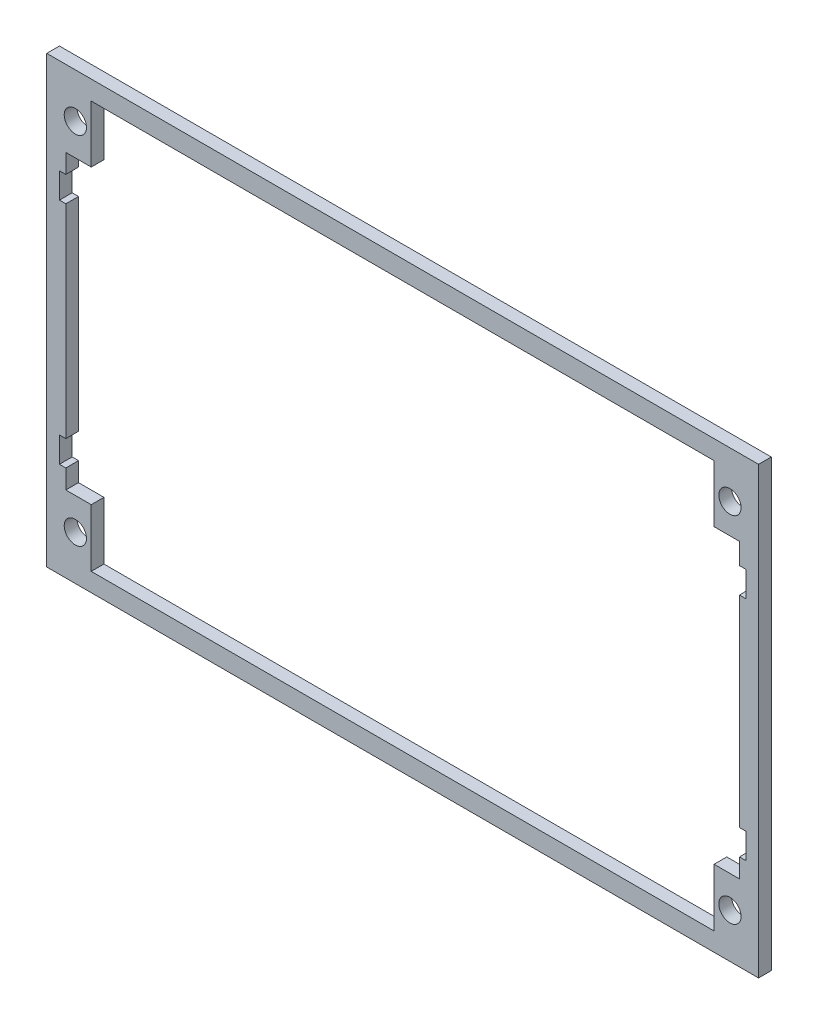
ISO-10303-21;
HEADER;
FILE_DESCRIPTION(('STEP AP214'),'2;1');
FILE_NAME('part.step','',(''),(''),'','','');
FILE_SCHEMA(('AUTOMOTIVE_DESIGN { 1 0 10303 214 1 1 1 1 }'));
ENDSEC;
DATA;
#1=APPLICATION_CONTEXT('core data for automotive mechanical design processes');
#2=APPLICATION_PROTOCOL_DEFINITION('international standard','automotive_design',2000,#1);
#3=PRODUCT_CONTEXT('',#1,'mechanical');
#4=PRODUCT('Part','Part','',(#3));
#5=PRODUCT_RELATED_PRODUCT_CATEGORY('part','',(#4));
#6=PRODUCT_DEFINITION_FORMATION('','',#4);
#7=PRODUCT_DEFINITION_CONTEXT('part definition',#1,'design');
#8=PRODUCT_DEFINITION('design','',#6,#7);
#9=PRODUCT_DEFINITION_SHAPE('','',#8);
#10=(LENGTH_UNIT() NAMED_UNIT(*) SI_UNIT(.MILLI.,.METRE.));
#11=(NAMED_UNIT(*) PLANE_ANGLE_UNIT() SI_UNIT($,.RADIAN.));
#12=(NAMED_UNIT(*) SI_UNIT($,.STERADIAN.) SOLID_ANGLE_UNIT());
#13=UNCERTAINTY_MEASURE_WITH_UNIT(LENGTH_MEASURE(1.E-05),#10,'distance_accuracy_value','');
#14=(GEOMETRIC_REPRESENTATION_CONTEXT(3) GLOBAL_UNCERTAINTY_ASSIGNED_CONTEXT((#13)) GLOBAL_UNIT_ASSIGNED_CONTEXT((#10,
#11,#12)) REPRESENTATION_CONTEXT('',''));
#15=CARTESIAN_POINT('',(0.,0.,0.));
#16=DIRECTION('',(0.,0.,1.));
#17=DIRECTION('',(1.,0.,0.));
#18=AXIS2_PLACEMENT_3D('',#15,#16,#17);
#19=CARTESIAN_POINT('',(109.,58.,0.));
#20=DIRECTION('',(1.,0.,0.));
#21=DIRECTION('',(0.,1.,0.));
#22=AXIS2_PLACEMENT_3D('',#19,#20,#21);
#23=PLANE('',#22);
#24=DIRECTION('',(0.,1.,0.));
#25=VECTOR('',#24,1.);
#26=CARTESIAN_POINT('',(109.,58.,0.));
#27=LINE('',#26,#25);
#28=CARTESIAN_POINT('',(109.,19.,0.));
#29=VERTEX_POINT('',#28);
#30=CARTESIAN_POINT('',(109.,50.6898312661624,0.));
#31=VERTEX_POINT('',#30);
#32=EDGE_CURVE('E484',#29,#31,#27,.T.);
#33=ORIENTED_EDGE('',*,*,#32,.F.);
#34=DIRECTION('',(0.,0.,1.));
#35=VECTOR('',#34,1.);
#36=CARTESIAN_POINT('',(109.,19.,0.));
#37=LINE('',#36,#35);
#38=CARTESIAN_POINT('',(109.,19.,2.));
#39=VERTEX_POINT('',#38);
#40=EDGE_CURVE('E288',#29,#39,#37,.T.);
#41=ORIENTED_EDGE('',*,*,#40,.T.);
#42=DIRECTION('',(0.,1.,0.));
#43=VECTOR('',#42,1.);
#44=CARTESIAN_POINT('',(109.,58.,2.));
#45=LINE('',#44,#43);
#46=CARTESIAN_POINT('',(109.,50.6898312661624,2.));
#47=VERTEX_POINT('',#46);
#48=EDGE_CURVE('E497',#39,#47,#45,.T.);
#49=ORIENTED_EDGE('',*,*,#48,.T.);
#50=DIRECTION('',(0.,0.,1.));
#51=VECTOR('',#50,1.);
#52=CARTESIAN_POINT('',(109.,50.6898312661624,0.));
#53=LINE('',#52,#51);
#54=EDGE_CURVE('E346',#31,#47,#53,.T.);
#55=ORIENTED_EDGE('',*,*,#54,.F.);
#56=EDGE_LOOP('',(#33,#41,#49,#55));
#57=FACE_BOUND('',#56,.T.);
#58=ADVANCED_FACE('F39',(#57),#23,.F.);
#59=CARTESIAN_POINT('',(109.,54.6898312661624,0.));
#60=VERTEX_POINT('',#59);
#61=CARTESIAN_POINT('',(109.,58.,0.));
#62=VERTEX_POINT('',#61);
#63=EDGE_CURVE('E479',#60,#62,#27,.T.);
#64=ORIENTED_EDGE('',*,*,#63,.F.);
#65=DIRECTION('',(0.,0.,1.));
#66=VECTOR('',#65,1.);
#67=CARTESIAN_POINT('',(109.,54.6898312661624,0.));
#68=LINE('',#67,#66);
#69=CARTESIAN_POINT('',(109.,54.6898312661624,2.));
#70=VERTEX_POINT('',#69);
#71=EDGE_CURVE('E316',#60,#70,#68,.T.);
#72=ORIENTED_EDGE('',*,*,#71,.T.);
#73=CARTESIAN_POINT('',(109.,58.,2.));
#74=VERTEX_POINT('',#73);
#75=EDGE_CURVE('E492',#70,#74,#45,.T.);
#76=ORIENTED_EDGE('',*,*,#75,.T.);
#77=DIRECTION('',(0.,0.,1.));
#78=VECTOR('',#77,1.);
#79=CARTESIAN_POINT('',(109.,58.,0.));
#80=LINE('',#79,#78);
#81=EDGE_CURVE('E504',#62,#74,#80,.T.);
#82=ORIENTED_EDGE('',*,*,#81,.F.);
#83=EDGE_LOOP('',(#64,#72,#76,#82));
#84=FACE_BOUND('',#83,.T.);
#85=ADVANCED_FACE('F625',(#84),#23,.F.);
#86=CARTESIAN_POINT('',(3.,12.,0.));
#87=DIRECTION('',(-1.,0.,0.));
#88=DIRECTION('',(0.,0.,1.));
#89=AXIS2_PLACEMENT_3D('',#86,#87,#88);
#90=PLANE('',#89);
#91=DIRECTION('',(0.,-1.,0.));
#92=VECTOR('',#91,1.);
#93=CARTESIAN_POINT('',(3.,12.,0.));
#94=LINE('',#93,#92);
#95=CARTESIAN_POINT('',(3.,51.,0.));
#96=VERTEX_POINT('',#95);
#97=CARTESIAN_POINT('',(3.,19.,0.));
#98=VERTEX_POINT('',#97);
#99=EDGE_CURVE('E439',#96,#98,#94,.T.);
#100=ORIENTED_EDGE('',*,*,#99,.F.);
#101=DIRECTION('',(0.,0.,1.));
#102=VECTOR('',#101,1.);
#103=CARTESIAN_POINT('',(3.,51.,0.));
#104=LINE('',#103,#102);
#105=CARTESIAN_POINT('',(3.,51.,2.));
#106=VERTEX_POINT('',#105);
#107=EDGE_CURVE('E392',#96,#106,#104,.T.);
#108=ORIENTED_EDGE('',*,*,#107,.T.);
#109=DIRECTION('',(0.,-1.,0.));
#110=VECTOR('',#109,1.);
#111=CARTESIAN_POINT('',(3.,12.,2.));
#112=LINE('',#111,#110);
#113=CARTESIAN_POINT('',(3.,19.,2.));
#114=VERTEX_POINT('',#113);
#115=EDGE_CURVE('E454',#106,#114,#112,.T.);
#116=ORIENTED_EDGE('',*,*,#115,.T.);
#117=DIRECTION('',(0.,0.,1.));
#118=VECTOR('',#117,1.);
#119=CARTESIAN_POINT('',(3.,19.,0.));
#120=LINE('',#119,#118);
#121=EDGE_CURVE('E310',#98,#114,#120,.T.);
#122=ORIENTED_EDGE('',*,*,#121,.F.);
#123=EDGE_LOOP('',(#100,#108,#116,#122));
#124=FACE_BOUND('',#123,.T.);
#125=ADVANCED_FACE('F632',(#124),#90,.F.);
#126=CARTESIAN_POINT('',(3.,15.,0.));
#127=VERTEX_POINT('',#126);
#128=CARTESIAN_POINT('',(3.,12.,0.));
#129=VERTEX_POINT('',#128);
#130=EDGE_CURVE('E440',#127,#129,#94,.T.);
#131=ORIENTED_EDGE('',*,*,#130,.F.);
#132=DIRECTION('',(0.,0.,1.));
#133=VECTOR('',#132,1.);
#134=CARTESIAN_POINT('',(3.,15.,0.));
#135=LINE('',#134,#133);
#136=CARTESIAN_POINT('',(3.,15.,2.));
#137=VERTEX_POINT('',#136);
#138=EDGE_CURVE('E322',#127,#137,#135,.T.);
#139=ORIENTED_EDGE('',*,*,#138,.T.);
#140=CARTESIAN_POINT('',(3.,12.,2.));
#141=VERTEX_POINT('',#140);
#142=EDGE_CURVE('E455',#137,#141,#112,.T.);
#143=ORIENTED_EDGE('',*,*,#142,.T.);
#144=DIRECTION('',(0.,0.,1.));
#145=VECTOR('',#144,1.);
#146=CARTESIAN_POINT('',(3.,12.,0.));
#147=LINE('',#146,#145);
#148=EDGE_CURVE('E448',#129,#141,#147,.T.);
#149=ORIENTED_EDGE('',*,*,#148,.F.);
#150=EDGE_LOOP('',(#131,#139,#143,#149));
#151=FACE_BOUND('',#150,.T.);
#152=ADVANCED_FACE('F687',(#151),#90,.F.);
#153=CARTESIAN_POINT('',(7.,2.90873982616941,0.));
#154=DIRECTION('',(-1.,0.,0.));
#155=DIRECTION('',(0.,0.,1.));
#156=AXIS2_PLACEMENT_3D('',#153,#154,#155);
#157=PLANE('',#156);
#158=DIRECTION('',(0.,-1.,0.));
#159=VECTOR('',#158,1.);
#160=CARTESIAN_POINT('',(7.,2.90873982616941,2.));
#161=LINE('',#160,#159);
#162=CARTESIAN_POINT('',(7.,67.,2.));
#163=VERTEX_POINT('',#162);
#164=CARTESIAN_POINT('',(7.,58.,2.));
#165=VERTEX_POINT('',#164);
#166=EDGE_CURVE('E532',#163,#165,#161,.T.);
#167=ORIENTED_EDGE('',*,*,#166,.T.);
#168=DIRECTION('',(0.,0.,1.));
#169=VECTOR('',#168,1.);
#170=CARTESIAN_POINT('',(7.,58.,0.));
#171=LINE('',#170,#169);
#172=CARTESIAN_POINT('',(7.,58.,0.));
#173=VERTEX_POINT('',#172);
#174=EDGE_CURVE('E466',#173,#165,#171,.T.);
#175=ORIENTED_EDGE('',*,*,#174,.F.);
#176=DIRECTION('',(0.,-1.,0.));
#177=VECTOR('',#176,1.);
#178=CARTESIAN_POINT('',(7.,2.90873982616941,0.));
#179=LINE('',#178,#177);
#180=CARTESIAN_POINT('',(7.,67.,0.));
#181=VERTEX_POINT('',#180);
#182=EDGE_CURVE('E513',#181,#173,#179,.T.);
#183=ORIENTED_EDGE('',*,*,#182,.F.);
#184=DIRECTION('',(0.,0.,1.));
#185=VECTOR('',#184,1.);
#186=CARTESIAN_POINT('',(7.,67.,0.));
#187=LINE('',#186,#185);
#188=EDGE_CURVE('E549',#181,#163,#187,.T.);
#189=ORIENTED_EDGE('',*,*,#188,.T.);
#190=EDGE_LOOP('',(#167,#175,#183,#189));
#191=FACE_BOUND('',#190,.T.);
#192=ADVANCED_FACE('F710',(#191),#157,.F.);
#193=CARTESIAN_POINT('',(105.,2.90873982616941,0.));
#194=DIRECTION('',(1.,0.,0.));
#195=DIRECTION('',(0.,0.,-1.));
#196=AXIS2_PLACEMENT_3D('',#193,#194,#195);
#197=PLANE('',#196);
#198=DIRECTION('',(0.,1.,0.));
#199=VECTOR('',#198,1.);
#200=CARTESIAN_POINT('',(105.,2.90873982616941,0.));
#201=LINE('',#200,#199);
#202=CARTESIAN_POINT('',(105.,58.,0.));
#203=VERTEX_POINT('',#202);
#204=CARTESIAN_POINT('',(105.,67.,0.));
#205=VERTEX_POINT('',#204);
#206=EDGE_CURVE('E522',#203,#205,#201,.T.);
#207=ORIENTED_EDGE('',*,*,#206,.F.);
#208=DIRECTION('',(0.,0.,1.));
#209=VECTOR('',#208,1.);
#210=CARTESIAN_POINT('',(105.,58.,0.));
#211=LINE('',#210,#209);
#212=CARTESIAN_POINT('',(105.,58.,2.));
#213=VERTEX_POINT('',#212);
#214=EDGE_CURVE('E500',#203,#213,#211,.T.);
#215=ORIENTED_EDGE('',*,*,#214,.T.);
#216=DIRECTION('',(0.,1.,0.));
#217=VECTOR('',#216,1.);
#218=CARTESIAN_POINT('',(105.,2.90873982616941,2.));
#219=LINE('',#218,#217);
#220=CARTESIAN_POINT('',(105.,67.,2.));
#221=VERTEX_POINT('',#220);
#222=EDGE_CURVE('E540',#213,#221,#219,.T.);
#223=ORIENTED_EDGE('',*,*,#222,.T.);
#224=DIRECTION('',(0.,0.,1.));
#225=VECTOR('',#224,1.);
#226=CARTESIAN_POINT('',(105.,67.,0.));
#227=LINE('',#226,#225);
#228=EDGE_CURVE('E553',#205,#221,#227,.T.);
#229=ORIENTED_EDGE('',*,*,#228,.F.);
#230=EDGE_LOOP('',(#207,#215,#223,#229));
#231=FACE_BOUND('',#230,.T.);
#232=ADVANCED_FACE('F623',(#231),#197,.F.);
#233=CARTESIAN_POINT('',(0.,0.,2.));
#234=DIRECTION('',(1.,0.,0.));
#235=DIRECTION('',(0.,0.,-1.));
#236=AXIS2_PLACEMENT_3D('',#233,#234,#235);
#237=PLANE('',#236);
#238=DIRECTION('',(0.,-1.,0.));
#239=VECTOR('',#238,1.);
#240=CARTESIAN_POINT('',(0.,0.,0.));
#241=LINE('',#240,#239);
#242=CARTESIAN_POINT('',(0.,70.,0.));
#243=VERTEX_POINT('',#242);
#244=CARTESIAN_POINT('',(0.,0.,0.));
#245=VERTEX_POINT('',#244);
#246=EDGE_CURVE('E552',#243,#245,#241,.T.);
#247=ORIENTED_EDGE('',*,*,#246,.T.);
#248=DIRECTION('',(0.,0.,-1.));
#249=VECTOR('',#248,1.);
#250=CARTESIAN_POINT('',(0.,0.,2.));
#251=LINE('',#250,#249);
#252=CARTESIAN_POINT('',(0.,0.,2.));
#253=VERTEX_POINT('',#252);
#254=EDGE_CURVE('E11',#253,#245,#251,.T.);
#255=ORIENTED_EDGE('',*,*,#254,.F.);
#256=DIRECTION('',(0.,-1.,0.));
#257=VECTOR('',#256,1.);
#258=CARTESIAN_POINT('',(0.,0.,2.));
#259=LINE('',#258,#257);
#260=CARTESIAN_POINT('',(0.,70.,2.));
#261=VERTEX_POINT('',#260);
#262=EDGE_CURVE('E563',#261,#253,#259,.T.);
#263=ORIENTED_EDGE('',*,*,#262,.F.);
#264=DIRECTION('',(0.,0.,-1.));
#265=VECTOR('',#264,1.);
#266=CARTESIAN_POINT('',(0.,70.,2.));
#267=LINE('',#266,#265);
#268=EDGE_CURVE('E577',#261,#243,#267,.T.);
#269=ORIENTED_EDGE('',*,*,#268,.T.);
#270=EDGE_LOOP('',(#247,#255,#263,#269));
#271=FACE_BOUND('',#270,.T.);
#272=ADVANCED_FACE('F41',(#271),#237,.F.);
#273=CARTESIAN_POINT('',(0.,0.,2.));
#274=DIRECTION('',(0.,1.,0.));
#275=DIRECTION('',(0.,0.,1.));
#276=AXIS2_PLACEMENT_3D('',#273,#274,#275);
#277=PLANE('',#276);
#278=DIRECTION('',(1.,0.,0.));
#279=VECTOR('',#278,1.);
#280=CARTESIAN_POINT('',(0.,0.,0.));
#281=LINE('',#280,#279);
#282=CARTESIAN_POINT('',(112.,0.,0.));
#283=VERTEX_POINT('',#282);
#284=EDGE_CURVE('E581',#245,#283,#281,.T.);
#285=ORIENTED_EDGE('',*,*,#284,.T.);
#286=DIRECTION('',(0.,0.,-1.));
#287=VECTOR('',#286,1.);
#288=CARTESIAN_POINT('',(112.,0.,2.));
#289=LINE('',#288,#287);
#290=CARTESIAN_POINT('',(112.,0.,2.));
#291=VERTEX_POINT('',#290);
#292=EDGE_CURVE('E48',#291,#283,#289,.T.);
#293=ORIENTED_EDGE('',*,*,#292,.F.);
#294=DIRECTION('',(1.,0.,0.));
#295=VECTOR('',#294,1.);
#296=CARTESIAN_POINT('',(0.,0.,2.));
#297=LINE('',#296,#295);
#298=EDGE_CURVE('E567',#253,#291,#297,.T.);
#299=ORIENTED_EDGE('',*,*,#298,.F.);
#300=ORIENTED_EDGE('',*,*,#254,.T.);
#301=EDGE_LOOP('',(#285,#293,#299,#300));
#302=FACE_BOUND('',#301,.T.);
#303=ADVANCED_FACE('F616',(#302),#277,.F.);
#304=CARTESIAN_POINT('',(112.,0.,2.));
#305=DIRECTION('',(-1.,0.,0.));
#306=DIRECTION('',(0.,0.,1.));
#307=AXIS2_PLACEMENT_3D('',#304,#305,#306);
#308=PLANE('',#307);
#309=DIRECTION('',(0.,1.,0.));
#310=VECTOR('',#309,1.);
#311=CARTESIAN_POINT('',(112.,0.,0.));
#312=LINE('',#311,#310);
#313=CARTESIAN_POINT('',(112.,70.,0.));
#314=VERTEX_POINT('',#313);
#315=EDGE_CURVE('E584',#283,#314,#312,.T.);
#316=ORIENTED_EDGE('',*,*,#315,.T.);
#317=DIRECTION('',(0.,0.,-1.));
#318=VECTOR('',#317,1.);
#319=CARTESIAN_POINT('',(112.,70.,2.));
#320=LINE('',#319,#318);
#321=CARTESIAN_POINT('',(112.,70.,2.));
#322=VERTEX_POINT('',#321);
#323=EDGE_CURVE('E592',#322,#314,#320,.T.);
#324=ORIENTED_EDGE('',*,*,#323,.F.);
#325=DIRECTION('',(0.,1.,0.));
#326=VECTOR('',#325,1.);
#327=CARTESIAN_POINT('',(112.,0.,2.));
#328=LINE('',#327,#326);
#329=EDGE_CURVE('E571',#291,#322,#328,.T.);
#330=ORIENTED_EDGE('',*,*,#329,.F.);
#331=ORIENTED_EDGE('',*,*,#292,.T.);
#332=EDGE_LOOP('',(#316,#324,#330,#331));
#333=FACE_BOUND('',#332,.T.);
#334=ADVANCED_FACE('F601',(#333),#308,.F.);
#335=CARTESIAN_POINT('',(0.,70.,2.));
#336=DIRECTION('',(0.,-1.,0.));
#337=DIRECTION('',(0.,0.,-1.));
#338=AXIS2_PLACEMENT_3D('',#335,#336,#337);
#339=PLANE('',#338);
#340=DIRECTION('',(-1.,0.,0.));
#341=VECTOR('',#340,1.);
#342=CARTESIAN_POINT('',(0.,70.,0.));
#343=LINE('',#342,#341);
#344=EDGE_CURVE('E568',#314,#243,#343,.T.);
#345=ORIENTED_EDGE('',*,*,#344,.T.);
#346=ORIENTED_EDGE('',*,*,#268,.F.);
#347=DIRECTION('',(-1.,0.,0.));
#348=VECTOR('',#347,1.);
#349=CARTESIAN_POINT('',(0.,70.,2.));
#350=LINE('',#349,#348);
#351=EDGE_CURVE('E574',#322,#261,#350,.T.);
#352=ORIENTED_EDGE('',*,*,#351,.F.);
#353=ORIENTED_EDGE('',*,*,#323,.T.);
#354=EDGE_LOOP('',(#345,#346,#352,#353));
#355=FACE_BOUND('',#354,.T.);
#356=ADVANCED_FACE('F609',(#355),#339,.F.);
#357=CARTESIAN_POINT('',(0.,0.,2.));
#358=DIRECTION('',(0.,0.,-1.));
#359=DIRECTION('',(-1.,0.,0.));
#360=AXIS2_PLACEMENT_3D('',#357,#358,#359);
#361=PLANE('',#360);
#362=CARTESIAN_POINT('',(4.5,7.,2.));
#363=DIRECTION('',(0.,0.,1.));
#364=DIRECTION('',(1.,0.,0.));
#365=AXIS2_PLACEMENT_3D('',#362,#363,#364);
#366=CIRCLE('',#365,1.75);
#367=CARTESIAN_POINT('',(6.25,7.,2.));
#368=VERTEX_POINT('',#367);
#369=EDGE_CURVE('E372',#368,#368,#366,.T.);
#370=ORIENTED_EDGE('',*,*,#369,.F.);
#371=EDGE_LOOP('',(#370));
#372=FACE_BOUND('',#371,.T.);
#373=CARTESIAN_POINT('',(107.5,7.,2.));
#374=DIRECTION('',(0.,0.,1.));
#375=DIRECTION('',(1.,0.,0.));
#376=AXIS2_PLACEMENT_3D('',#373,#374,#375);
#377=CIRCLE('',#376,1.75);
#378=CARTESIAN_POINT('',(109.25,7.,2.));
#379=VERTEX_POINT('',#378);
#380=EDGE_CURVE('E380',#379,#379,#377,.T.);
#381=ORIENTED_EDGE('',*,*,#380,.F.);
#382=EDGE_LOOP('',(#381));
#383=FACE_BOUND('',#382,.T.);
#384=CARTESIAN_POINT('',(107.5,62.6898312661624,2.));
#385=DIRECTION('',(0.,0.,1.));
#386=DIRECTION('',(1.,0.,0.));
#387=AXIS2_PLACEMENT_3D('',#384,#385,#386);
#388=CIRCLE('',#387,1.75);
#389=CARTESIAN_POINT('',(109.25,62.6898312661624,2.));
#390=VERTEX_POINT('',#389);
#391=EDGE_CURVE('E388',#390,#390,#388,.T.);
#392=ORIENTED_EDGE('',*,*,#391,.F.);
#393=EDGE_LOOP('',(#392));
#394=FACE_BOUND('',#393,.T.);
#395=CARTESIAN_POINT('',(4.5,63.,2.));
#396=DIRECTION('',(0.,0.,1.));
#397=DIRECTION('',(1.,0.,0.));
#398=AXIS2_PLACEMENT_3D('',#395,#396,#397);
#399=CIRCLE('',#398,1.75);
#400=CARTESIAN_POINT('',(6.25,63.,2.));
#401=VERTEX_POINT('',#400);
#402=EDGE_CURVE('E371',#401,#401,#399,.T.);
#403=ORIENTED_EDGE('',*,*,#402,.F.);
#404=EDGE_LOOP('',(#403));
#405=FACE_BOUND('',#404,.T.);
#406=ORIENTED_EDGE('',*,*,#115,.F.);
#407=DIRECTION('',(1.,0.,0.));
#408=VECTOR('',#407,1.);
#409=CARTESIAN_POINT('',(3.,51.,2.));
#410=LINE('',#409,#408);
#411=CARTESIAN_POINT('',(2.,51.,2.));
#412=VERTEX_POINT('',#411);
#413=EDGE_CURVE('E398',#412,#106,#410,.T.);
#414=ORIENTED_EDGE('',*,*,#413,.F.);
#415=DIRECTION('',(0.,-1.,0.));
#416=VECTOR('',#415,1.);
#417=CARTESIAN_POINT('',(2.,55.,2.));
#418=LINE('',#417,#416);
#419=CARTESIAN_POINT('',(2.,55.,2.));
#420=VERTEX_POINT('',#419);
#421=EDGE_CURVE('E409',#420,#412,#418,.T.);
#422=ORIENTED_EDGE('',*,*,#421,.F.);
#423=DIRECTION('',(-1.,0.,0.));
#424=VECTOR('',#423,1.);
#425=CARTESIAN_POINT('',(3.,55.,2.));
#426=LINE('',#425,#424);
#427=CARTESIAN_POINT('',(3.,55.,2.));
#428=VERTEX_POINT('',#427);
#429=EDGE_CURVE('E326',#428,#420,#426,.T.);
#430=ORIENTED_EDGE('',*,*,#429,.F.);
#431=CARTESIAN_POINT('',(3.,58.,2.));
#432=VERTEX_POINT('',#431);
#433=EDGE_CURVE('E449',#432,#428,#112,.T.);
#434=ORIENTED_EDGE('',*,*,#433,.F.);
#435=DIRECTION('',(-1.,0.,0.));
#436=VECTOR('',#435,1.);
#437=CARTESIAN_POINT('',(3.,58.,2.));
#438=LINE('',#437,#436);
#439=EDGE_CURVE('E458',#165,#432,#438,.T.);
#440=ORIENTED_EDGE('',*,*,#439,.F.);
#441=ORIENTED_EDGE('',*,*,#166,.F.);
#442=DIRECTION('',(-1.,0.,0.));
#443=VECTOR('',#442,1.);
#444=CARTESIAN_POINT('',(7.,67.,2.));
#445=LINE('',#444,#443);
#446=EDGE_CURVE('E545',#221,#163,#445,.T.);
#447=ORIENTED_EDGE('',*,*,#446,.F.);
#448=ORIENTED_EDGE('',*,*,#222,.F.);
#449=DIRECTION('',(-1.,0.,0.));
#450=VECTOR('',#449,1.);
#451=CARTESIAN_POINT('',(105.,58.,2.));
#452=LINE('',#451,#450);
#453=EDGE_CURVE('E480',#74,#213,#452,.T.);
#454=ORIENTED_EDGE('',*,*,#453,.F.);
#455=ORIENTED_EDGE('',*,*,#75,.F.);
#456=DIRECTION('',(-1.,0.,0.));
#457=VECTOR('',#456,1.);
#458=CARTESIAN_POINT('',(109.,54.6898312661624,2.));
#459=LINE('',#458,#457);
#460=CARTESIAN_POINT('',(110.,54.6898312661624,2.));
#461=VERTEX_POINT('',#460);
#462=EDGE_CURVE('E338',#461,#70,#459,.T.);
#463=ORIENTED_EDGE('',*,*,#462,.F.);
#464=DIRECTION('',(0.,1.,0.));
#465=VECTOR('',#464,1.);
#466=CARTESIAN_POINT('',(110.,54.6898312661624,2.));
#467=LINE('',#466,#465);
#468=CARTESIAN_POINT('',(110.,50.6898312661624,2.));
#469=VERTEX_POINT('',#468);
#470=EDGE_CURVE('E350',#469,#461,#467,.T.);
#471=ORIENTED_EDGE('',*,*,#470,.F.);
#472=DIRECTION('',(1.,0.,0.));
#473=VECTOR('',#472,1.);
#474=CARTESIAN_POINT('',(109.,50.6898312661624,2.));
#475=LINE('',#474,#473);
#476=EDGE_CURVE('E292',#47,#469,#475,.T.);
#477=ORIENTED_EDGE('',*,*,#476,.F.);
#478=ORIENTED_EDGE('',*,*,#48,.F.);
#479=DIRECTION('',(-1.,0.,0.));
#480=VECTOR('',#479,1.);
#481=CARTESIAN_POINT('',(109.,19.,2.));
#482=LINE('',#481,#480);
#483=CARTESIAN_POINT('',(110.,19.,2.));
#484=VERTEX_POINT('',#483);
#485=EDGE_CURVE('E276',#484,#39,#482,.T.);
#486=ORIENTED_EDGE('',*,*,#485,.F.);
#487=DIRECTION('',(0.,1.,0.));
#488=VECTOR('',#487,1.);
#489=CARTESIAN_POINT('',(110.,19.,2.));
#490=LINE('',#489,#488);
#491=CARTESIAN_POINT('',(110.,15.,2.));
#492=VERTEX_POINT('',#491);
#493=EDGE_CURVE('E279',#492,#484,#490,.T.);
#494=ORIENTED_EDGE('',*,*,#493,.F.);
#495=DIRECTION('',(1.,0.,0.));
#496=VECTOR('',#495,1.);
#497=CARTESIAN_POINT('',(109.,15.,2.));
#498=LINE('',#497,#496);
#499=CARTESIAN_POINT('',(109.,15.,2.));
#500=VERTEX_POINT('',#499);
#501=EDGE_CURVE('E251',#500,#492,#498,.T.);
#502=ORIENTED_EDGE('',*,*,#501,.F.);
#503=CARTESIAN_POINT('',(109.,12.,2.));
#504=VERTEX_POINT('',#503);
#505=EDGE_CURVE('E493',#504,#500,#45,.T.);
#506=ORIENTED_EDGE('',*,*,#505,.F.);
#507=DIRECTION('',(1.,0.,0.));
#508=VECTOR('',#507,1.);
#509=CARTESIAN_POINT('',(105.,12.,2.));
#510=LINE('',#509,#508);
#511=CARTESIAN_POINT('',(105.,12.,2.));
#512=VERTEX_POINT('',#511);
#513=EDGE_CURVE('E430',#512,#504,#510,.T.);
#514=ORIENTED_EDGE('',*,*,#513,.F.);
#515=CARTESIAN_POINT('',(105.,2.90873982616941,2.));
#516=VERTEX_POINT('',#515);
#517=EDGE_CURVE('E541',#516,#512,#219,.T.);
#518=ORIENTED_EDGE('',*,*,#517,.F.);
#519=DIRECTION('',(1.,0.,0.));
#520=VECTOR('',#519,1.);
#521=CARTESIAN_POINT('',(7.,2.90873982616941,2.));
#522=LINE('',#521,#520);
#523=CARTESIAN_POINT('',(7.,2.90873982616941,2.));
#524=VERTEX_POINT('',#523);
#525=EDGE_CURVE('E536',#524,#516,#522,.T.);
#526=ORIENTED_EDGE('',*,*,#525,.F.);
#527=CARTESIAN_POINT('',(7.,12.,2.));
#528=VERTEX_POINT('',#527);
#529=EDGE_CURVE('E465',#528,#524,#161,.T.);
#530=ORIENTED_EDGE('',*,*,#529,.F.);
#531=DIRECTION('',(1.,0.,0.));
#532=VECTOR('',#531,1.);
#533=CARTESIAN_POINT('',(3.,12.,2.));
#534=LINE('',#533,#532);
#535=EDGE_CURVE('E453',#141,#528,#534,.T.);
#536=ORIENTED_EDGE('',*,*,#535,.F.);
#537=ORIENTED_EDGE('',*,*,#142,.F.);
#538=DIRECTION('',(1.,0.,0.));
#539=VECTOR('',#538,1.);
#540=CARTESIAN_POINT('',(3.,15.,2.));
#541=LINE('',#540,#539);
#542=CARTESIAN_POINT('',(2.,15.,2.));
#543=VERTEX_POINT('',#542);
#544=EDGE_CURVE('E302',#543,#137,#541,.T.);
#545=ORIENTED_EDGE('',*,*,#544,.F.);
#546=DIRECTION('',(0.,-1.,0.));
#547=VECTOR('',#546,1.);
#548=CARTESIAN_POINT('',(2.,15.,2.));
#549=LINE('',#548,#547);
#550=CARTESIAN_POINT('',(2.,19.,2.));
#551=VERTEX_POINT('',#550);
#552=EDGE_CURVE('E315',#551,#543,#549,.T.);
#553=ORIENTED_EDGE('',*,*,#552,.F.);
#554=DIRECTION('',(-1.,0.,0.));
#555=VECTOR('',#554,1.);
#556=CARTESIAN_POINT('',(3.,19.,2.));
#557=LINE('',#556,#555);
#558=EDGE_CURVE('E311',#114,#551,#557,.T.);
#559=ORIENTED_EDGE('',*,*,#558,.F.);
#560=EDGE_LOOP('',(#406,#414,#422,#430,#434,#440,#441,#447,#448,#454,#455,#463,#471,#477,#478,
#486,#494,#502,#506,#514,#518,#526,#530,#536,#537,#545,#553,#559));
#561=FACE_BOUND('',#560,.T.);
#562=ORIENTED_EDGE('',*,*,#262,.T.);
#563=ORIENTED_EDGE('',*,*,#298,.T.);
#564=ORIENTED_EDGE('',*,*,#329,.T.);
#565=ORIENTED_EDGE('',*,*,#351,.T.);
#566=EDGE_LOOP('',(#562,#563,#564,#565));
#567=FACE_BOUND('',#566,.T.);
#568=ADVANCED_FACE('F615',(#372,#383,#394,#405,#561,#567),#361,.F.);
#569=CARTESIAN_POINT('',(0.,0.,0.));
#570=DIRECTION('',(0.,0.,-1.));
#571=DIRECTION('',(-1.,0.,0.));
#572=AXIS2_PLACEMENT_3D('',#569,#570,#571);
#573=PLANE('',#572);
#574=CARTESIAN_POINT('',(4.5,7.,0.));
#575=DIRECTION('',(0.,0.,1.));
#576=DIRECTION('',(1.,0.,0.));
#577=AXIS2_PLACEMENT_3D('',#574,#575,#576);
#578=CIRCLE('',#577,1.75);
#579=CARTESIAN_POINT('',(6.25,7.,0.));
#580=VERTEX_POINT('',#579);
#581=EDGE_CURVE('E367',#580,#580,#578,.T.);
#582=ORIENTED_EDGE('',*,*,#581,.T.);
#583=EDGE_LOOP('',(#582));
#584=FACE_BOUND('',#583,.T.);
#585=CARTESIAN_POINT('',(107.5,7.,0.));
#586=DIRECTION('',(0.,0.,1.));
#587=DIRECTION('',(1.,0.,0.));
#588=AXIS2_PLACEMENT_3D('',#585,#586,#587);
#589=CIRCLE('',#588,1.75);
#590=CARTESIAN_POINT('',(109.25,7.,0.));
#591=VERTEX_POINT('',#590);
#592=EDGE_CURVE('E376',#591,#591,#589,.T.);
#593=ORIENTED_EDGE('',*,*,#592,.T.);
#594=EDGE_LOOP('',(#593));
#595=FACE_BOUND('',#594,.T.);
#596=CARTESIAN_POINT('',(107.5,62.6898312661624,0.));
#597=DIRECTION('',(0.,0.,1.));
#598=DIRECTION('',(1.,0.,0.));
#599=AXIS2_PLACEMENT_3D('',#596,#597,#598);
#600=CIRCLE('',#599,1.75);
#601=CARTESIAN_POINT('',(109.25,62.6898312661624,0.));
#602=VERTEX_POINT('',#601);
#603=EDGE_CURVE('E384',#602,#602,#600,.T.);
#604=ORIENTED_EDGE('',*,*,#603,.T.);
#605=EDGE_LOOP('',(#604));
#606=FACE_BOUND('',#605,.T.);
#607=DIRECTION('',(1.,0.,0.));
#608=VECTOR('',#607,1.);
#609=CARTESIAN_POINT('',(3.,51.,0.));
#610=LINE('',#609,#608);
#611=CARTESIAN_POINT('',(2.,51.,0.));
#612=VERTEX_POINT('',#611);
#613=EDGE_CURVE('E402',#612,#96,#610,.T.);
#614=ORIENTED_EDGE('',*,*,#613,.T.);
#615=ORIENTED_EDGE('',*,*,#99,.T.);
#616=DIRECTION('',(-1.,0.,0.));
#617=VECTOR('',#616,1.);
#618=CARTESIAN_POINT('',(3.,19.,0.));
#619=LINE('',#618,#617);
#620=CARTESIAN_POINT('',(2.,19.,0.));
#621=VERTEX_POINT('',#620);
#622=EDGE_CURVE('E297',#98,#621,#619,.T.);
#623=ORIENTED_EDGE('',*,*,#622,.T.);
#624=DIRECTION('',(0.,-1.,0.));
#625=VECTOR('',#624,1.);
#626=CARTESIAN_POINT('',(2.,15.,0.));
#627=LINE('',#626,#625);
#628=CARTESIAN_POINT('',(2.,15.,0.));
#629=VERTEX_POINT('',#628);
#630=EDGE_CURVE('E301',#621,#629,#627,.T.);
#631=ORIENTED_EDGE('',*,*,#630,.T.);
#632=DIRECTION('',(1.,0.,0.));
#633=VECTOR('',#632,1.);
#634=CARTESIAN_POINT('',(3.,15.,0.));
#635=LINE('',#634,#633);
#636=EDGE_CURVE('E306',#629,#127,#635,.T.);
#637=ORIENTED_EDGE('',*,*,#636,.T.);
#638=ORIENTED_EDGE('',*,*,#130,.T.);
#639=DIRECTION('',(1.,0.,0.));
#640=VECTOR('',#639,1.);
#641=CARTESIAN_POINT('',(3.,12.,0.));
#642=LINE('',#641,#640);
#643=CARTESIAN_POINT('',(7.,12.,0.));
#644=VERTEX_POINT('',#643);
#645=EDGE_CURVE('E438',#129,#644,#642,.T.);
#646=ORIENTED_EDGE('',*,*,#645,.T.);
#647=CARTESIAN_POINT('',(7.,2.90873982616941,0.));
#648=VERTEX_POINT('',#647);
#649=EDGE_CURVE('E518',#644,#648,#179,.T.);
#650=ORIENTED_EDGE('',*,*,#649,.T.);
#651=DIRECTION('',(1.,0.,0.));
#652=VECTOR('',#651,1.);
#653=CARTESIAN_POINT('',(7.,2.90873982616941,0.));
#654=LINE('',#653,#652);
#655=CARTESIAN_POINT('',(105.,2.90873982616941,0.));
#656=VERTEX_POINT('',#655);
#657=EDGE_CURVE('E517',#648,#656,#654,.T.);
#658=ORIENTED_EDGE('',*,*,#657,.T.);
#659=CARTESIAN_POINT('',(105.,12.,0.));
#660=VERTEX_POINT('',#659);
#661=EDGE_CURVE('E523',#656,#660,#201,.T.);
#662=ORIENTED_EDGE('',*,*,#661,.T.);
#663=DIRECTION('',(1.,0.,0.));
#664=VECTOR('',#663,1.);
#665=CARTESIAN_POINT('',(105.,12.,0.));
#666=LINE('',#665,#664);
#667=CARTESIAN_POINT('',(109.,12.,0.));
#668=VERTEX_POINT('',#667);
#669=EDGE_CURVE('E476',#660,#668,#666,.T.);
#670=ORIENTED_EDGE('',*,*,#669,.T.);
#671=CARTESIAN_POINT('',(109.,15.,0.));
#672=VERTEX_POINT('',#671);
#673=EDGE_CURVE('E274',#668,#672,#27,.T.);
#674=ORIENTED_EDGE('',*,*,#673,.T.);
#675=DIRECTION('',(1.,0.,0.));
#676=VECTOR('',#675,1.);
#677=CARTESIAN_POINT('',(109.,15.,0.));
#678=LINE('',#677,#676);
#679=CARTESIAN_POINT('',(110.,15.,0.));
#680=VERTEX_POINT('',#679);
#681=EDGE_CURVE('E63',#672,#680,#678,.T.);
#682=ORIENTED_EDGE('',*,*,#681,.T.);
#683=DIRECTION('',(0.,1.,0.));
#684=VECTOR('',#683,1.);
#685=CARTESIAN_POINT('',(110.,19.,0.));
#686=LINE('',#685,#684);
#687=CARTESIAN_POINT('',(110.,19.,0.));
#688=VERTEX_POINT('',#687);
#689=EDGE_CURVE('E260',#680,#688,#686,.T.);
#690=ORIENTED_EDGE('',*,*,#689,.T.);
#691=DIRECTION('',(-1.,0.,0.));
#692=VECTOR('',#691,1.);
#693=CARTESIAN_POINT('',(109.,19.,0.));
#694=LINE('',#693,#692);
#695=EDGE_CURVE('E266',#688,#29,#694,.T.);
#696=ORIENTED_EDGE('',*,*,#695,.T.);
#697=ORIENTED_EDGE('',*,*,#32,.T.);
#698=DIRECTION('',(1.,0.,0.));
#699=VECTOR('',#698,1.);
#700=CARTESIAN_POINT('',(109.,50.6898312661624,0.));
#701=LINE('',#700,#699);
#702=CARTESIAN_POINT('',(110.,50.6898312661624,0.));
#703=VERTEX_POINT('',#702);
#704=EDGE_CURVE('E55',#31,#703,#701,.T.);
#705=ORIENTED_EDGE('',*,*,#704,.T.);
#706=DIRECTION('',(0.,1.,0.));
#707=VECTOR('',#706,1.);
#708=CARTESIAN_POINT('',(110.,54.6898312661624,0.));
#709=LINE('',#708,#707);
#710=CARTESIAN_POINT('',(110.,54.6898312661624,0.));
#711=VERTEX_POINT('',#710);
#712=EDGE_CURVE('E337',#703,#711,#709,.T.);
#713=ORIENTED_EDGE('',*,*,#712,.T.);
#714=DIRECTION('',(-1.,0.,0.));
#715=VECTOR('',#714,1.);
#716=CARTESIAN_POINT('',(109.,54.6898312661624,0.));
#717=LINE('',#716,#715);
#718=EDGE_CURVE('E342',#711,#60,#717,.T.);
#719=ORIENTED_EDGE('',*,*,#718,.T.);
#720=ORIENTED_EDGE('',*,*,#63,.T.);
#721=DIRECTION('',(-1.,0.,0.));
#722=VECTOR('',#721,1.);
#723=CARTESIAN_POINT('',(105.,58.,0.));
#724=LINE('',#723,#722);
#725=EDGE_CURVE('E483',#62,#203,#724,.T.);
#726=ORIENTED_EDGE('',*,*,#725,.T.);
#727=ORIENTED_EDGE('',*,*,#206,.T.);
#728=DIRECTION('',(-1.,0.,0.));
#729=VECTOR('',#728,1.);
#730=CARTESIAN_POINT('',(7.,67.,0.));
#731=LINE('',#730,#729);
#732=EDGE_CURVE('E527',#205,#181,#731,.T.);
#733=ORIENTED_EDGE('',*,*,#732,.T.);
#734=ORIENTED_EDGE('',*,*,#182,.T.);
#735=DIRECTION('',(-1.,0.,0.));
#736=VECTOR('',#735,1.);
#737=CARTESIAN_POINT('',(3.,58.,0.));
#738=LINE('',#737,#736);
#739=CARTESIAN_POINT('',(3.,58.,0.));
#740=VERTEX_POINT('',#739);
#741=EDGE_CURVE('E444',#173,#740,#738,.T.);
#742=ORIENTED_EDGE('',*,*,#741,.T.);
#743=CARTESIAN_POINT('',(3.,55.,0.));
#744=VERTEX_POINT('',#743);
#745=EDGE_CURVE('E434',#740,#744,#94,.T.);
#746=ORIENTED_EDGE('',*,*,#745,.T.);
#747=DIRECTION('',(-1.,0.,0.));
#748=VECTOR('',#747,1.);
#749=CARTESIAN_POINT('',(3.,55.,0.));
#750=LINE('',#749,#748);
#751=CARTESIAN_POINT('',(2.,55.,0.));
#752=VERTEX_POINT('',#751);
#753=EDGE_CURVE('E393',#744,#752,#750,.T.);
#754=ORIENTED_EDGE('',*,*,#753,.T.);
#755=DIRECTION('',(0.,-1.,0.));
#756=VECTOR('',#755,1.);
#757=CARTESIAN_POINT('',(2.,55.,0.));
#758=LINE('',#757,#756);
#759=EDGE_CURVE('E397',#752,#612,#758,.T.);
#760=ORIENTED_EDGE('',*,*,#759,.T.);
#761=EDGE_LOOP('',(#614,#615,#623,#631,#637,#638,#646,#650,#658,#662,#670,#674,#682,#690,#696,
#697,#705,#713,#719,#720,#726,#727,#733,#734,#742,#746,#754,#760));
#762=FACE_BOUND('',#761,.T.);
#763=CARTESIAN_POINT('',(4.5,63.,0.));
#764=DIRECTION('',(0.,0.,1.));
#765=DIRECTION('',(1.,0.,0.));
#766=AXIS2_PLACEMENT_3D('',#763,#764,#765);
#767=CIRCLE('',#766,1.75);
#768=CARTESIAN_POINT('',(6.25,63.,0.));
#769=VERTEX_POINT('',#768);
#770=EDGE_CURVE('E426',#769,#769,#767,.T.);
#771=ORIENTED_EDGE('',*,*,#770,.T.);
#772=EDGE_LOOP('',(#771));
#773=FACE_BOUND('',#772,.T.);
#774=ORIENTED_EDGE('',*,*,#246,.F.);
#775=ORIENTED_EDGE('',*,*,#344,.F.);
#776=ORIENTED_EDGE('',*,*,#315,.F.);
#777=ORIENTED_EDGE('',*,*,#284,.F.);
#778=EDGE_LOOP('',(#774,#775,#776,#777));
#779=FACE_BOUND('',#778,.T.);
#780=ADVANCED_FACE('F270',(#584,#595,#606,#762,#773,#779),#573,.T.);
#781=ORIENTED_EDGE('',*,*,#649,.F.);
#782=DIRECTION('',(0.,0.,1.));
#783=VECTOR('',#782,1.);
#784=CARTESIAN_POINT('',(7.,12.,0.));
#785=LINE('',#784,#783);
#786=EDGE_CURVE('E469',#644,#528,#785,.T.);
#787=ORIENTED_EDGE('',*,*,#786,.T.);
#788=ORIENTED_EDGE('',*,*,#529,.T.);
#789=DIRECTION('',(0.,0.,1.));
#790=VECTOR('',#789,1.);
#791=CARTESIAN_POINT('',(7.,2.90873982616941,0.));
#792=LINE('',#791,#790);
#793=EDGE_CURVE('E531',#648,#524,#792,.T.);
#794=ORIENTED_EDGE('',*,*,#793,.F.);
#795=EDGE_LOOP('',(#781,#787,#788,#794));
#796=FACE_BOUND('',#795,.T.);
#797=ADVANCED_FACE('F698',(#796),#157,.F.);
#798=CARTESIAN_POINT('',(7.,67.,0.));
#799=DIRECTION('',(0.,1.,0.));
#800=DIRECTION('',(0.,0.,1.));
#801=AXIS2_PLACEMENT_3D('',#798,#799,#800);
#802=PLANE('',#801);
#803=ORIENTED_EDGE('',*,*,#446,.T.);
#804=ORIENTED_EDGE('',*,*,#188,.F.);
#805=ORIENTED_EDGE('',*,*,#732,.F.);
#806=ORIENTED_EDGE('',*,*,#228,.T.);
#807=EDGE_LOOP('',(#803,#804,#805,#806));
#808=FACE_BOUND('',#807,.T.);
#809=ADVANCED_FACE('F706',(#808),#802,.F.);
#810=ORIENTED_EDGE('',*,*,#517,.T.);
#811=DIRECTION('',(0.,0.,1.));
#812=VECTOR('',#811,1.);
#813=CARTESIAN_POINT('',(105.,12.,0.));
#814=LINE('',#813,#812);
#815=EDGE_CURVE('E488',#660,#512,#814,.T.);
#816=ORIENTED_EDGE('',*,*,#815,.F.);
#817=ORIENTED_EDGE('',*,*,#661,.F.);
#818=DIRECTION('',(0.,0.,1.));
#819=VECTOR('',#818,1.);
#820=CARTESIAN_POINT('',(105.,2.90873982616941,0.));
#821=LINE('',#820,#819);
#822=EDGE_CURVE('E557',#656,#516,#821,.T.);
#823=ORIENTED_EDGE('',*,*,#822,.T.);
#824=EDGE_LOOP('',(#810,#816,#817,#823));
#825=FACE_BOUND('',#824,.T.);
#826=ADVANCED_FACE('F803',(#825),#197,.F.);
#827=CARTESIAN_POINT('',(7.,2.90873982616941,0.));
#828=DIRECTION('',(0.,-1.,0.));
#829=DIRECTION('',(0.,0.,-1.));
#830=AXIS2_PLACEMENT_3D('',#827,#828,#829);
#831=PLANE('',#830);
#832=ORIENTED_EDGE('',*,*,#525,.T.);
#833=ORIENTED_EDGE('',*,*,#822,.F.);
#834=ORIENTED_EDGE('',*,*,#657,.F.);
#835=ORIENTED_EDGE('',*,*,#793,.T.);
#836=EDGE_LOOP('',(#832,#833,#834,#835));
#837=FACE_BOUND('',#836,.T.);
#838=ADVANCED_FACE('F647',(#837),#831,.F.);
#839=CARTESIAN_POINT('',(105.,58.,0.));
#840=DIRECTION('',(0.,1.,0.));
#841=DIRECTION('',(0.,0.,1.));
#842=AXIS2_PLACEMENT_3D('',#839,#840,#841);
#843=PLANE('',#842);
#844=ORIENTED_EDGE('',*,*,#453,.T.);
#845=ORIENTED_EDGE('',*,*,#214,.F.);
#846=ORIENTED_EDGE('',*,*,#725,.F.);
#847=ORIENTED_EDGE('',*,*,#81,.T.);
#848=EDGE_LOOP('',(#844,#845,#846,#847));
#849=FACE_BOUND('',#848,.T.);
#850=ADVANCED_FACE('F639',(#849),#843,.F.);
#851=ORIENTED_EDGE('',*,*,#505,.T.);
#852=DIRECTION('',(0.,0.,1.));
#853=VECTOR('',#852,1.);
#854=CARTESIAN_POINT('',(109.,15.,0.));
#855=LINE('',#854,#853);
#856=EDGE_CURVE('E257',#672,#500,#855,.T.);
#857=ORIENTED_EDGE('',*,*,#856,.F.);
#858=ORIENTED_EDGE('',*,*,#673,.F.);
#859=DIRECTION('',(0.,0.,1.));
#860=VECTOR('',#859,1.);
#861=CARTESIAN_POINT('',(109.,12.,0.));
#862=LINE('',#861,#860);
#863=EDGE_CURVE('E508',#668,#504,#862,.T.);
#864=ORIENTED_EDGE('',*,*,#863,.T.);
#865=EDGE_LOOP('',(#851,#857,#858,#864));
#866=FACE_BOUND('',#865,.T.);
#867=ADVANCED_FACE('F628',(#866),#23,.F.);
#868=CARTESIAN_POINT('',(105.,12.,0.));
#869=DIRECTION('',(0.,-1.,0.));
#870=DIRECTION('',(0.,0.,-1.));
#871=AXIS2_PLACEMENT_3D('',#868,#869,#870);
#872=PLANE('',#871);
#873=ORIENTED_EDGE('',*,*,#513,.T.);
#874=ORIENTED_EDGE('',*,*,#863,.F.);
#875=ORIENTED_EDGE('',*,*,#669,.F.);
#876=ORIENTED_EDGE('',*,*,#815,.T.);
#877=EDGE_LOOP('',(#873,#874,#875,#876));
#878=FACE_BOUND('',#877,.T.);
#879=ADVANCED_FACE('F638',(#878),#872,.F.);
#880=ORIENTED_EDGE('',*,*,#433,.T.);
#881=DIRECTION('',(0.,0.,1.));
#882=VECTOR('',#881,1.);
#883=CARTESIAN_POINT('',(3.,55.,0.));
#884=LINE('',#883,#882);
#885=EDGE_CURVE('E405',#744,#428,#884,.T.);
#886=ORIENTED_EDGE('',*,*,#885,.F.);
#887=ORIENTED_EDGE('',*,*,#745,.F.);
#888=DIRECTION('',(0.,0.,1.));
#889=VECTOR('',#888,1.);
#890=CARTESIAN_POINT('',(3.,58.,0.));
#891=LINE('',#890,#889);
#892=EDGE_CURVE('E462',#740,#432,#891,.T.);
#893=ORIENTED_EDGE('',*,*,#892,.T.);
#894=EDGE_LOOP('',(#880,#886,#887,#893));
#895=FACE_BOUND('',#894,.T.);
#896=ADVANCED_FACE('F645',(#895),#90,.F.);
#897=CARTESIAN_POINT('',(3.,58.,0.));
#898=DIRECTION('',(0.,1.,0.));
#899=DIRECTION('',(0.,0.,1.));
#900=AXIS2_PLACEMENT_3D('',#897,#898,#899);
#901=PLANE('',#900);
#902=ORIENTED_EDGE('',*,*,#439,.T.);
#903=ORIENTED_EDGE('',*,*,#892,.F.);
#904=ORIENTED_EDGE('',*,*,#741,.F.);
#905=ORIENTED_EDGE('',*,*,#174,.T.);
#906=EDGE_LOOP('',(#902,#903,#904,#905));
#907=FACE_BOUND('',#906,.T.);
#908=ADVANCED_FACE('F713',(#907),#901,.F.);
#909=CARTESIAN_POINT('',(3.,12.,0.));
#910=DIRECTION('',(0.,-1.,0.));
#911=DIRECTION('',(0.,0.,-1.));
#912=AXIS2_PLACEMENT_3D('',#909,#910,#911);
#913=PLANE('',#912);
#914=ORIENTED_EDGE('',*,*,#535,.T.);
#915=ORIENTED_EDGE('',*,*,#786,.F.);
#916=ORIENTED_EDGE('',*,*,#645,.F.);
#917=ORIENTED_EDGE('',*,*,#148,.T.);
#918=EDGE_LOOP('',(#914,#915,#916,#917));
#919=FACE_BOUND('',#918,.T.);
#920=ADVANCED_FACE('F692',(#919),#913,.F.);
#921=CARTESIAN_POINT('',(3.,15.,0.));
#922=DIRECTION('',(0.,-1.,0.));
#923=DIRECTION('',(1.,0.,0.));
#924=AXIS2_PLACEMENT_3D('',#921,#922,#923);
#925=PLANE('',#924);
#926=ORIENTED_EDGE('',*,*,#544,.T.);
#927=ORIENTED_EDGE('',*,*,#138,.F.);
#928=ORIENTED_EDGE('',*,*,#636,.F.);
#929=DIRECTION('',(0.,0.,1.));
#930=VECTOR('',#929,1.);
#931=CARTESIAN_POINT('',(2.,15.,0.));
#932=LINE('',#931,#930);
#933=EDGE_CURVE('E327',#629,#543,#932,.T.);
#934=ORIENTED_EDGE('',*,*,#933,.T.);
#935=EDGE_LOOP('',(#926,#927,#928,#934));
#936=FACE_BOUND('',#935,.T.);
#937=ADVANCED_FACE('F740',(#936),#925,.F.);
#938=CARTESIAN_POINT('',(2.,15.,0.));
#939=DIRECTION('',(-1.,0.,0.));
#940=DIRECTION('',(0.,0.,1.));
#941=AXIS2_PLACEMENT_3D('',#938,#939,#940);
#942=PLANE('',#941);
#943=ORIENTED_EDGE('',*,*,#552,.T.);
#944=ORIENTED_EDGE('',*,*,#933,.F.);
#945=ORIENTED_EDGE('',*,*,#630,.F.);
#946=DIRECTION('',(0.,0.,1.));
#947=VECTOR('',#946,1.);
#948=CARTESIAN_POINT('',(2.,19.,0.));
#949=LINE('',#948,#947);
#950=EDGE_CURVE('E330',#621,#551,#949,.T.);
#951=ORIENTED_EDGE('',*,*,#950,.T.);
#952=EDGE_LOOP('',(#943,#944,#945,#951));
#953=FACE_BOUND('',#952,.T.);
#954=ADVANCED_FACE('F736',(#953),#942,.F.);
#955=CARTESIAN_POINT('',(3.,19.,0.));
#956=DIRECTION('',(0.,1.,0.));
#957=DIRECTION('',(-1.,0.,0.));
#958=AXIS2_PLACEMENT_3D('',#955,#956,#957);
#959=PLANE('',#958);
#960=ORIENTED_EDGE('',*,*,#558,.T.);
#961=ORIENTED_EDGE('',*,*,#950,.F.);
#962=ORIENTED_EDGE('',*,*,#622,.F.);
#963=ORIENTED_EDGE('',*,*,#121,.T.);
#964=EDGE_LOOP('',(#960,#961,#962,#963));
#965=FACE_BOUND('',#964,.T.);
#966=ADVANCED_FACE('F733',(#965),#959,.F.);
#967=CARTESIAN_POINT('',(3.,51.,0.));
#968=DIRECTION('',(0.,-1.,0.));
#969=DIRECTION('',(0.,0.,-1.));
#970=AXIS2_PLACEMENT_3D('',#967,#968,#969);
#971=PLANE('',#970);
#972=ORIENTED_EDGE('',*,*,#413,.T.);
#973=ORIENTED_EDGE('',*,*,#107,.F.);
#974=ORIENTED_EDGE('',*,*,#613,.F.);
#975=DIRECTION('',(0.,0.,1.));
#976=VECTOR('',#975,1.);
#977=CARTESIAN_POINT('',(2.,51.,0.));
#978=LINE('',#977,#976);
#979=EDGE_CURVE('E418',#612,#412,#978,.T.);
#980=ORIENTED_EDGE('',*,*,#979,.T.);
#981=EDGE_LOOP('',(#972,#973,#974,#980));
#982=FACE_BOUND('',#981,.T.);
#983=ADVANCED_FACE('F754',(#982),#971,.F.);
#984=CARTESIAN_POINT('',(2.,55.,0.));
#985=DIRECTION('',(-1.,0.,0.));
#986=DIRECTION('',(0.,-1.,0.));
#987=AXIS2_PLACEMENT_3D('',#984,#985,#986);
#988=PLANE('',#987);
#989=ORIENTED_EDGE('',*,*,#421,.T.);
#990=ORIENTED_EDGE('',*,*,#979,.F.);
#991=ORIENTED_EDGE('',*,*,#759,.F.);
#992=DIRECTION('',(0.,0.,1.));
#993=VECTOR('',#992,1.);
#994=CARTESIAN_POINT('',(2.,55.,0.));
#995=LINE('',#994,#993);
#996=EDGE_CURVE('E421',#752,#420,#995,.T.);
#997=ORIENTED_EDGE('',*,*,#996,.T.);
#998=EDGE_LOOP('',(#989,#990,#991,#997));
#999=FACE_BOUND('',#998,.T.);
#1000=ADVANCED_FACE('F724',(#999),#988,.F.);
#1001=CARTESIAN_POINT('',(3.,55.,0.));
#1002=DIRECTION('',(0.,1.,0.));
#1003=DIRECTION('',(0.,0.,1.));
#1004=AXIS2_PLACEMENT_3D('',#1001,#1002,#1003);
#1005=PLANE('',#1004);
#1006=ORIENTED_EDGE('',*,*,#429,.T.);
#1007=ORIENTED_EDGE('',*,*,#996,.F.);
#1008=ORIENTED_EDGE('',*,*,#753,.F.);
#1009=ORIENTED_EDGE('',*,*,#885,.T.);
#1010=EDGE_LOOP('',(#1006,#1007,#1008,#1009));
#1011=FACE_BOUND('',#1010,.T.);
#1012=ADVANCED_FACE('F720',(#1011),#1005,.F.);
#1013=CARTESIAN_POINT('',(109.,54.6898312661624,0.));
#1014=DIRECTION('',(0.,1.,0.));
#1015=DIRECTION('',(0.,0.,1.));
#1016=AXIS2_PLACEMENT_3D('',#1013,#1014,#1015);
#1017=PLANE('',#1016);
#1018=ORIENTED_EDGE('',*,*,#462,.T.);
#1019=ORIENTED_EDGE('',*,*,#71,.F.);
#1020=ORIENTED_EDGE('',*,*,#718,.F.);
#1021=DIRECTION('',(0.,0.,1.));
#1022=VECTOR('',#1021,1.);
#1023=CARTESIAN_POINT('',(110.,54.6898312661624,0.));
#1024=LINE('',#1023,#1022);
#1025=EDGE_CURVE('E359',#711,#461,#1024,.T.);
#1026=ORIENTED_EDGE('',*,*,#1025,.T.);
#1027=EDGE_LOOP('',(#1018,#1019,#1020,#1026));
#1028=FACE_BOUND('',#1027,.T.);
#1029=ADVANCED_FACE('F755',(#1028),#1017,.F.);
#1030=CARTESIAN_POINT('',(110.,54.6898312661624,0.));
#1031=DIRECTION('',(1.,0.,0.));
#1032=DIRECTION('',(0.,0.,-1.));
#1033=AXIS2_PLACEMENT_3D('',#1030,#1031,#1032);
#1034=PLANE('',#1033);
#1035=ORIENTED_EDGE('',*,*,#470,.T.);
#1036=ORIENTED_EDGE('',*,*,#1025,.F.);
#1037=ORIENTED_EDGE('',*,*,#712,.F.);
#1038=DIRECTION('',(0.,0.,1.));
#1039=VECTOR('',#1038,1.);
#1040=CARTESIAN_POINT('',(110.,50.6898312661624,0.));
#1041=LINE('',#1040,#1039);
#1042=EDGE_CURVE('E362',#703,#469,#1041,.T.);
#1043=ORIENTED_EDGE('',*,*,#1042,.T.);
#1044=EDGE_LOOP('',(#1035,#1036,#1037,#1043));
#1045=FACE_BOUND('',#1044,.T.);
#1046=ADVANCED_FACE('F758',(#1045),#1034,.F.);
#1047=CARTESIAN_POINT('',(109.,50.6898312661624,0.));
#1048=DIRECTION('',(0.,-1.,0.));
#1049=DIRECTION('',(0.,0.,-1.));
#1050=AXIS2_PLACEMENT_3D('',#1047,#1048,#1049);
#1051=PLANE('',#1050);
#1052=ORIENTED_EDGE('',*,*,#476,.T.);
#1053=ORIENTED_EDGE('',*,*,#1042,.F.);
#1054=ORIENTED_EDGE('',*,*,#704,.F.);
#1055=ORIENTED_EDGE('',*,*,#54,.T.);
#1056=EDGE_LOOP('',(#1052,#1053,#1054,#1055));
#1057=FACE_BOUND('',#1056,.T.);
#1058=ADVANCED_FACE('F762',(#1057),#1051,.F.);
#1059=CARTESIAN_POINT('',(109.,19.,0.));
#1060=DIRECTION('',(0.,1.,0.));
#1061=DIRECTION('',(0.,0.,1.));
#1062=AXIS2_PLACEMENT_3D('',#1059,#1060,#1061);
#1063=PLANE('',#1062);
#1064=ORIENTED_EDGE('',*,*,#485,.T.);
#1065=ORIENTED_EDGE('',*,*,#40,.F.);
#1066=ORIENTED_EDGE('',*,*,#695,.F.);
#1067=DIRECTION('',(0.,0.,1.));
#1068=VECTOR('',#1067,1.);
#1069=CARTESIAN_POINT('',(110.,19.,0.));
#1070=LINE('',#1069,#1068);
#1071=EDGE_CURVE('E256',#688,#484,#1070,.T.);
#1072=ORIENTED_EDGE('',*,*,#1071,.T.);
#1073=EDGE_LOOP('',(#1064,#1065,#1066,#1072));
#1074=FACE_BOUND('',#1073,.T.);
#1075=ADVANCED_FACE('F659',(#1074),#1063,.F.);
#1076=CARTESIAN_POINT('',(110.,19.,0.));
#1077=DIRECTION('',(1.,0.,0.));
#1078=DIRECTION('',(0.,0.,-1.));
#1079=AXIS2_PLACEMENT_3D('',#1076,#1077,#1078);
#1080=PLANE('',#1079);
#1081=ORIENTED_EDGE('',*,*,#493,.T.);
#1082=ORIENTED_EDGE('',*,*,#1071,.F.);
#1083=ORIENTED_EDGE('',*,*,#689,.F.);
#1084=DIRECTION('',(0.,0.,1.));
#1085=VECTOR('',#1084,1.);
#1086=CARTESIAN_POINT('',(110.,15.,0.));
#1087=LINE('',#1086,#1085);
#1088=EDGE_CURVE('E247',#680,#492,#1087,.T.);
#1089=ORIENTED_EDGE('',*,*,#1088,.T.);
#1090=EDGE_LOOP('',(#1081,#1082,#1083,#1089));
#1091=FACE_BOUND('',#1090,.T.);
#1092=ADVANCED_FACE('F261',(#1091),#1080,.F.);
#1093=CARTESIAN_POINT('',(109.,15.,0.));
#1094=DIRECTION('',(0.,-1.,0.));
#1095=DIRECTION('',(0.,0.,-1.));
#1096=AXIS2_PLACEMENT_3D('',#1093,#1094,#1095);
#1097=PLANE('',#1096);
#1098=ORIENTED_EDGE('',*,*,#501,.T.);
#1099=ORIENTED_EDGE('',*,*,#1088,.F.);
#1100=ORIENTED_EDGE('',*,*,#681,.F.);
#1101=ORIENTED_EDGE('',*,*,#856,.T.);
#1102=EDGE_LOOP('',(#1098,#1099,#1100,#1101));
#1103=FACE_BOUND('',#1102,.T.);
#1104=ADVANCED_FACE('F249',(#1103),#1097,.F.);
#1105=CARTESIAN_POINT('',(4.5,63.,0.));
#1106=DIRECTION('',(0.,0.,1.));
#1107=DIRECTION('',(1.,0.,0.));
#1108=AXIS2_PLACEMENT_3D('',#1105,#1106,#1107);
#1109=CYLINDRICAL_SURFACE('',#1108,1.75);
#1110=ORIENTED_EDGE('',*,*,#770,.F.);
#1111=EDGE_LOOP('',(#1110));
#1112=FACE_BOUND('',#1111,.T.);
#1113=ORIENTED_EDGE('',*,*,#402,.T.);
#1114=EDGE_LOOP('',(#1113));
#1115=FACE_BOUND('',#1114,.T.);
#1116=ADVANCED_FACE('F777',(#1112,#1115),#1109,.F.);
#1117=CARTESIAN_POINT('',(107.5,62.6898312661624,0.));
#1118=DIRECTION('',(0.,0.,1.));
#1119=DIRECTION('',(1.,0.,0.));
#1120=AXIS2_PLACEMENT_3D('',#1117,#1118,#1119);
#1121=CYLINDRICAL_SURFACE('',#1120,1.75);
#1122=ORIENTED_EDGE('',*,*,#603,.F.);
#1123=EDGE_LOOP('',(#1122));
#1124=FACE_BOUND('',#1123,.T.);
#1125=ORIENTED_EDGE('',*,*,#391,.T.);
#1126=EDGE_LOOP('',(#1125));
#1127=FACE_BOUND('',#1126,.T.);
#1128=ADVANCED_FACE('F773',(#1124,#1127),#1121,.F.);
#1129=CARTESIAN_POINT('',(107.5,7.,0.));
#1130=DIRECTION('',(0.,0.,1.));
#1131=DIRECTION('',(1.,0.,0.));
#1132=AXIS2_PLACEMENT_3D('',#1129,#1130,#1131);
#1133=CYLINDRICAL_SURFACE('',#1132,1.75);
#1134=ORIENTED_EDGE('',*,*,#592,.F.);
#1135=EDGE_LOOP('',(#1134));
#1136=FACE_BOUND('',#1135,.T.);
#1137=ORIENTED_EDGE('',*,*,#380,.T.);
#1138=EDGE_LOOP('',(#1137));
#1139=FACE_BOUND('',#1138,.T.);
#1140=ADVANCED_FACE('F769',(#1136,#1139),#1133,.F.);
#1141=CARTESIAN_POINT('',(4.5,7.,0.));
#1142=DIRECTION('',(0.,0.,1.));
#1143=DIRECTION('',(1.,0.,0.));
#1144=AXIS2_PLACEMENT_3D('',#1141,#1142,#1143);
#1145=CYLINDRICAL_SURFACE('',#1144,1.75);
#1146=ORIENTED_EDGE('',*,*,#581,.F.);
#1147=EDGE_LOOP('',(#1146));
#1148=FACE_BOUND('',#1147,.T.);
#1149=ORIENTED_EDGE('',*,*,#369,.T.);
#1150=EDGE_LOOP('',(#1149));
#1151=FACE_BOUND('',#1150,.T.);
#1152=ADVANCED_FACE('F766',(#1148,#1151),#1145,.F.);
#1153=CLOSED_SHELL('',(#58,#85,#125,#152,#192,#232,#272,#303,#334,#356,#568,#780,#797,#809,#826,
#838,#850,#867,#879,#896,#908,#920,#937,#954,#966,#983,#1000,#1012,#1029,#1046,#1058,#1075,
#1092,#1104,#1116,#1128,#1140,#1152));
#1154=MANIFOLD_SOLID_BREP('B2',#1153);
#1155=ADVANCED_BREP_SHAPE_REPRESENTATION('',(#18,#1154),#14);
#1156=SHAPE_DEFINITION_REPRESENTATION(#9,#1155);
ENDSEC;
END-ISO-10303-21;
